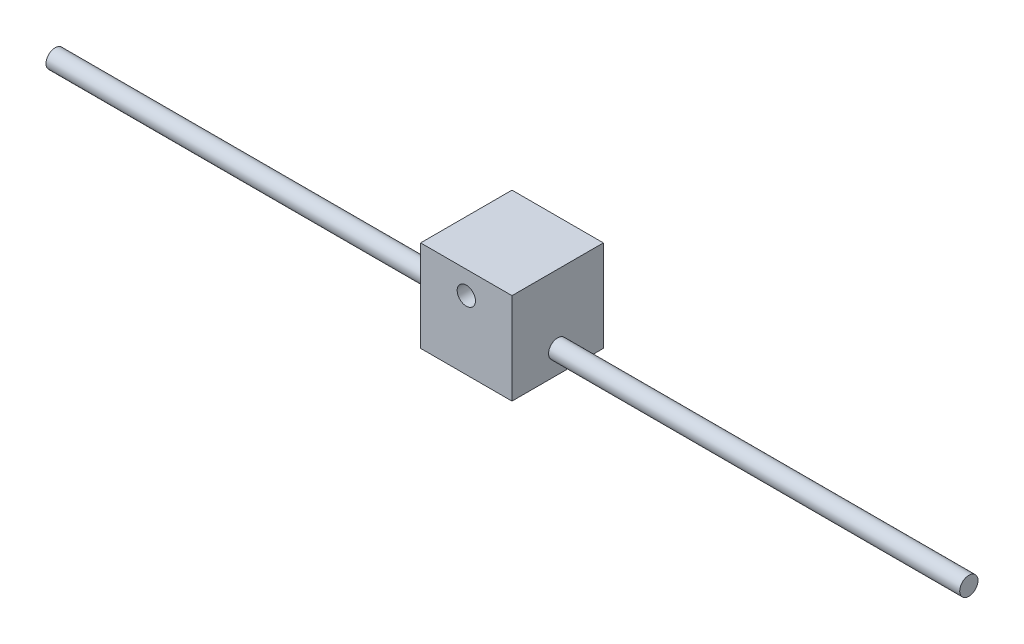
ISO-10303-21;
HEADER;
FILE_DESCRIPTION(('STEP AP214'),'2;1');
FILE_NAME('part.step','',(''),(''),'','','');
FILE_SCHEMA(('AUTOMOTIVE_DESIGN { 1 0 10303 214 1 1 1 1 }'));
ENDSEC;
DATA;
#1=APPLICATION_CONTEXT('core data for automotive mechanical design processes');
#2=APPLICATION_PROTOCOL_DEFINITION('international standard','automotive_design',2000,#1);
#3=PRODUCT_CONTEXT('',#1,'mechanical');
#4=PRODUCT('Part','Part','',(#3));
#5=PRODUCT_RELATED_PRODUCT_CATEGORY('part','',(#4));
#6=PRODUCT_DEFINITION_FORMATION('','',#4);
#7=PRODUCT_DEFINITION_CONTEXT('part definition',#1,'design');
#8=PRODUCT_DEFINITION('design','',#6,#7);
#9=PRODUCT_DEFINITION_SHAPE('','',#8);
#10=(LENGTH_UNIT() NAMED_UNIT(*) SI_UNIT(.MILLI.,.METRE.));
#11=(NAMED_UNIT(*) PLANE_ANGLE_UNIT() SI_UNIT($,.RADIAN.));
#12=(NAMED_UNIT(*) SI_UNIT($,.STERADIAN.) SOLID_ANGLE_UNIT());
#13=UNCERTAINTY_MEASURE_WITH_UNIT(LENGTH_MEASURE(1.E-05),#10,'distance_accuracy_value','');
#14=(GEOMETRIC_REPRESENTATION_CONTEXT(3) GLOBAL_UNCERTAINTY_ASSIGNED_CONTEXT((#13)) GLOBAL_UNIT_ASSIGNED_CONTEXT((#10,
#11,#12)) REPRESENTATION_CONTEXT('',''));
#15=CARTESIAN_POINT('',(0.,0.,0.));
#16=DIRECTION('',(0.,0.,1.));
#17=DIRECTION('',(1.,0.,0.));
#18=AXIS2_PLACEMENT_3D('',#15,#16,#17);
#19=CARTESIAN_POINT('',(200.,-10.,0.));
#20=DIRECTION('',(-1.,0.,0.));
#21=DIRECTION('',(0.,0.,1.));
#22=AXIS2_PLACEMENT_3D('',#19,#20,#21);
#23=CYLINDRICAL_SURFACE('',#22,4.);
#24=CARTESIAN_POINT('',(200.,-10.,0.));
#25=DIRECTION('',(1.,0.,0.));
#26=DIRECTION('',(0.,0.,-1.));
#27=AXIS2_PLACEMENT_3D('',#24,#25,#26);
#28=CIRCLE('',#27,4.);
#29=CARTESIAN_POINT('',(200.,-10.,-4.));
#30=VERTEX_POINT('',#29);
#31=EDGE_CURVE('E11',#30,#30,#28,.T.);
#32=ORIENTED_EDGE('',*,*,#31,.F.);
#33=EDGE_LOOP('',(#32));
#34=FACE_BOUND('',#33,.T.);
#35=CARTESIAN_POINT('',(-200.,-10.,0.));
#36=DIRECTION('',(1.,0.,0.));
#37=DIRECTION('',(0.,0.,-1.));
#38=AXIS2_PLACEMENT_3D('',#35,#36,#37);
#39=CIRCLE('',#38,4.);
#40=CARTESIAN_POINT('',(-200.,-10.,-4.));
#41=VERTEX_POINT('',#40);
#42=EDGE_CURVE('E43',#41,#41,#39,.T.);
#43=ORIENTED_EDGE('',*,*,#42,.T.);
#44=EDGE_LOOP('',(#43));
#45=FACE_BOUND('',#44,.T.);
#46=ADVANCED_FACE('F40',(#34,#45),#23,.T.);
#47=CARTESIAN_POINT('',(200.,-10.,0.));
#48=DIRECTION('',(1.,0.,0.));
#49=DIRECTION('',(0.,0.,-1.));
#50=AXIS2_PLACEMENT_3D('',#47,#48,#49);
#51=PLANE('',#50);
#52=ORIENTED_EDGE('',*,*,#31,.T.);
#53=EDGE_LOOP('',(#52));
#54=FACE_BOUND('',#53,.T.);
#55=ADVANCED_FACE('F55',(#54),#51,.T.);
#56=CARTESIAN_POINT('',(-200.,-10.,0.));
#57=DIRECTION('',(1.,0.,0.));
#58=DIRECTION('',(0.,0.,-1.));
#59=AXIS2_PLACEMENT_3D('',#56,#57,#58);
#60=PLANE('',#59);
#61=ORIENTED_EDGE('',*,*,#42,.F.);
#62=EDGE_LOOP('',(#61));
#63=FACE_BOUND('',#62,.T.);
#64=ADVANCED_FACE('F53',(#63),#60,.F.);
#65=CLOSED_SHELL('',(#46,#55,#64));
#66=MANIFOLD_SOLID_BREP('B2',#65);
#67=CARTESIAN_POINT('',(0.,0.,20.));
#68=DIRECTION('',(0.,0.,1.));
#69=DIRECTION('',(1.,0.,0.));
#70=AXIS2_PLACEMENT_3D('',#67,#68,#69);
#71=PLANE('',#70);
#72=DIRECTION('',(0.,-1.,0.));
#73=VECTOR('',#72,1.);
#74=CARTESIAN_POINT('',(-20.,20.,20.));
#75=LINE('',#74,#73);
#76=CARTESIAN_POINT('',(-20.,20.,20.));
#77=VERTEX_POINT('',#76);
#78=CARTESIAN_POINT('',(-20.,-20.,20.));
#79=VERTEX_POINT('',#78);
#80=EDGE_CURVE('E132',#77,#79,#75,.T.);
#81=ORIENTED_EDGE('',*,*,#80,.T.);
#82=DIRECTION('',(1.,0.,0.));
#83=VECTOR('',#82,1.);
#84=CARTESIAN_POINT('',(-20.,-20.,20.));
#85=LINE('',#84,#83);
#86=CARTESIAN_POINT('',(20.,-20.,20.));
#87=VERTEX_POINT('',#86);
#88=EDGE_CURVE('E127',#79,#87,#85,.T.);
#89=ORIENTED_EDGE('',*,*,#88,.T.);
#90=DIRECTION('',(0.,1.,0.));
#91=VECTOR('',#90,1.);
#92=CARTESIAN_POINT('',(20.,20.,20.));
#93=LINE('',#92,#91);
#94=CARTESIAN_POINT('',(20.,20.,20.));
#95=VERTEX_POINT('',#94);
#96=EDGE_CURVE('E130',#87,#95,#93,.T.);
#97=ORIENTED_EDGE('',*,*,#96,.T.);
#98=DIRECTION('',(-1.,0.,0.));
#99=VECTOR('',#98,1.);
#100=CARTESIAN_POINT('',(-20.,20.,20.));
#101=LINE('',#100,#99);
#102=EDGE_CURVE('E97',#95,#77,#101,.T.);
#103=ORIENTED_EDGE('',*,*,#102,.T.);
#104=EDGE_LOOP('',(#81,#89,#97,#103));
#105=FACE_BOUND('',#104,.T.);
#106=CARTESIAN_POINT('',(0.,10.,20.));
#107=DIRECTION('',(0.,0.,1.));
#108=DIRECTION('',(1.,0.,0.));
#109=AXIS2_PLACEMENT_3D('',#106,#107,#108);
#110=CIRCLE('',#109,4.);
#111=CARTESIAN_POINT('',(4.,10.,20.));
#112=VERTEX_POINT('',#111);
#113=EDGE_CURVE('E147',#112,#112,#110,.T.);
#114=ORIENTED_EDGE('',*,*,#113,.F.);
#115=EDGE_LOOP('',(#114));
#116=FACE_BOUND('',#115,.T.);
#117=ADVANCED_FACE('F80',(#105,#116),#71,.T.);
#118=CARTESIAN_POINT('',(0.,0.,-20.));
#119=DIRECTION('',(0.,0.,1.));
#120=DIRECTION('',(1.,0.,0.));
#121=AXIS2_PLACEMENT_3D('',#118,#119,#120);
#122=PLANE('',#121);
#123=DIRECTION('',(0.,-1.,0.));
#124=VECTOR('',#123,1.);
#125=CARTESIAN_POINT('',(-20.,20.,-20.));
#126=LINE('',#125,#124);
#127=CARTESIAN_POINT('',(-20.,20.,-20.));
#128=VERTEX_POINT('',#127);
#129=CARTESIAN_POINT('',(-20.,-20.,-20.));
#130=VERTEX_POINT('',#129);
#131=EDGE_CURVE('E144',#128,#130,#126,.T.);
#132=ORIENTED_EDGE('',*,*,#131,.F.);
#133=DIRECTION('',(-1.,0.,0.));
#134=VECTOR('',#133,1.);
#135=CARTESIAN_POINT('',(-20.,20.,-20.));
#136=LINE('',#135,#134);
#137=CARTESIAN_POINT('',(20.,20.,-20.));
#138=VERTEX_POINT('',#137);
#139=EDGE_CURVE('E120',#138,#128,#136,.T.);
#140=ORIENTED_EDGE('',*,*,#139,.F.);
#141=DIRECTION('',(0.,1.,0.));
#142=VECTOR('',#141,1.);
#143=CARTESIAN_POINT('',(20.,20.,-20.));
#144=LINE('',#143,#142);
#145=CARTESIAN_POINT('',(20.,-20.,-20.));
#146=VERTEX_POINT('',#145);
#147=EDGE_CURVE('E114',#146,#138,#144,.T.);
#148=ORIENTED_EDGE('',*,*,#147,.F.);
#149=DIRECTION('',(1.,0.,0.));
#150=VECTOR('',#149,1.);
#151=CARTESIAN_POINT('',(-20.,-20.,-20.));
#152=LINE('',#151,#150);
#153=EDGE_CURVE('E136',#130,#146,#152,.T.);
#154=ORIENTED_EDGE('',*,*,#153,.F.);
#155=EDGE_LOOP('',(#132,#140,#148,#154));
#156=FACE_BOUND('',#155,.T.);
#157=CARTESIAN_POINT('',(0.,10.,-20.));
#158=DIRECTION('',(0.,0.,1.));
#159=DIRECTION('',(1.,0.,0.));
#160=AXIS2_PLACEMENT_3D('',#157,#158,#159);
#161=CIRCLE('',#160,4.);
#162=CARTESIAN_POINT('',(4.,10.,-20.));
#163=VERTEX_POINT('',#162);
#164=EDGE_CURVE('E159',#163,#163,#161,.T.);
#165=ORIENTED_EDGE('',*,*,#164,.T.);
#166=EDGE_LOOP('',(#165));
#167=FACE_BOUND('',#166,.T.);
#168=ADVANCED_FACE('F155',(#156,#167),#122,.F.);
#169=CARTESIAN_POINT('',(-20.,20.,20.));
#170=DIRECTION('',(1.,0.,0.));
#171=DIRECTION('',(0.,1.,0.));
#172=AXIS2_PLACEMENT_3D('',#169,#170,#171);
#173=PLANE('',#172);
#174=CARTESIAN_POINT('',(-20.,-10.,0.));
#175=DIRECTION('',(1.,0.,0.));
#176=DIRECTION('',(0.,0.,-1.));
#177=AXIS2_PLACEMENT_3D('',#174,#175,#176);
#178=CIRCLE('',#177,4.);
#179=CARTESIAN_POINT('',(-20.,-10.,-4.));
#180=VERTEX_POINT('',#179);
#181=EDGE_CURVE('E162',#180,#180,#178,.T.);
#182=ORIENTED_EDGE('',*,*,#181,.T.);
#183=EDGE_LOOP('',(#182));
#184=FACE_BOUND('',#183,.T.);
#185=ORIENTED_EDGE('',*,*,#131,.T.);
#186=DIRECTION('',(0.,0.,-1.));
#187=VECTOR('',#186,1.);
#188=CARTESIAN_POINT('',(-20.,-20.,20.));
#189=LINE('',#188,#187);
#190=EDGE_CURVE('E38',#79,#130,#189,.T.);
#191=ORIENTED_EDGE('',*,*,#190,.F.);
#192=ORIENTED_EDGE('',*,*,#80,.F.);
#193=DIRECTION('',(0.,0.,-1.));
#194=VECTOR('',#193,1.);
#195=CARTESIAN_POINT('',(-20.,20.,20.));
#196=LINE('',#195,#194);
#197=EDGE_CURVE('E140',#77,#128,#196,.T.);
#198=ORIENTED_EDGE('',*,*,#197,.T.);
#199=EDGE_LOOP('',(#185,#191,#192,#198));
#200=FACE_BOUND('',#199,.T.);
#201=ADVANCED_FACE('F82',(#184,#200),#173,.F.);
#202=CARTESIAN_POINT('',(-20.,-20.,20.));
#203=DIRECTION('',(0.,1.,0.));
#204=DIRECTION('',(-1.,0.,0.));
#205=AXIS2_PLACEMENT_3D('',#202,#203,#204);
#206=PLANE('',#205);
#207=ORIENTED_EDGE('',*,*,#153,.T.);
#208=DIRECTION('',(0.,0.,-1.));
#209=VECTOR('',#208,1.);
#210=CARTESIAN_POINT('',(20.,-20.,20.));
#211=LINE('',#210,#209);
#212=EDGE_CURVE('E89',#87,#146,#211,.T.);
#213=ORIENTED_EDGE('',*,*,#212,.F.);
#214=ORIENTED_EDGE('',*,*,#88,.F.);
#215=ORIENTED_EDGE('',*,*,#190,.T.);
#216=EDGE_LOOP('',(#207,#213,#214,#215));
#217=FACE_BOUND('',#216,.T.);
#218=ADVANCED_FACE('F135',(#217),#206,.F.);
#219=CARTESIAN_POINT('',(20.,20.,20.));
#220=DIRECTION('',(-1.,0.,0.));
#221=DIRECTION('',(0.,0.,1.));
#222=AXIS2_PLACEMENT_3D('',#219,#220,#221);
#223=PLANE('',#222);
#224=CARTESIAN_POINT('',(20.,-10.,0.));
#225=DIRECTION('',(1.,0.,0.));
#226=DIRECTION('',(0.,0.,-1.));
#227=AXIS2_PLACEMENT_3D('',#224,#225,#226);
#228=CIRCLE('',#227,4.);
#229=CARTESIAN_POINT('',(20.,-10.,-4.));
#230=VERTEX_POINT('',#229);
#231=EDGE_CURVE('E165',#230,#230,#228,.T.);
#232=ORIENTED_EDGE('',*,*,#231,.F.);
#233=EDGE_LOOP('',(#232));
#234=FACE_BOUND('',#233,.T.);
#235=ORIENTED_EDGE('',*,*,#147,.T.);
#236=DIRECTION('',(0.,0.,-1.));
#237=VECTOR('',#236,1.);
#238=CARTESIAN_POINT('',(20.,20.,20.));
#239=LINE('',#238,#237);
#240=EDGE_CURVE('E137',#95,#138,#239,.T.);
#241=ORIENTED_EDGE('',*,*,#240,.F.);
#242=ORIENTED_EDGE('',*,*,#96,.F.);
#243=ORIENTED_EDGE('',*,*,#212,.T.);
#244=EDGE_LOOP('',(#235,#241,#242,#243));
#245=FACE_BOUND('',#244,.T.);
#246=ADVANCED_FACE('F138',(#234,#245),#223,.F.);
#247=CARTESIAN_POINT('',(-20.,20.,20.));
#248=DIRECTION('',(0.,-1.,0.));
#249=DIRECTION('',(1.,0.,0.));
#250=AXIS2_PLACEMENT_3D('',#247,#248,#249);
#251=PLANE('',#250);
#252=ORIENTED_EDGE('',*,*,#139,.T.);
#253=ORIENTED_EDGE('',*,*,#197,.F.);
#254=ORIENTED_EDGE('',*,*,#102,.F.);
#255=ORIENTED_EDGE('',*,*,#240,.T.);
#256=EDGE_LOOP('',(#252,#253,#254,#255));
#257=FACE_BOUND('',#256,.T.);
#258=ADVANCED_FACE('F152',(#257),#251,.F.);
#259=CARTESIAN_POINT('',(0.,10.,20.));
#260=DIRECTION('',(0.,0.,-1.));
#261=DIRECTION('',(-1.,0.,0.));
#262=AXIS2_PLACEMENT_3D('',#259,#260,#261);
#263=CYLINDRICAL_SURFACE('',#262,4.);
#264=ORIENTED_EDGE('',*,*,#113,.T.);
#265=EDGE_LOOP('',(#264));
#266=FACE_BOUND('',#265,.T.);
#267=ORIENTED_EDGE('',*,*,#164,.F.);
#268=EDGE_LOOP('',(#267));
#269=FACE_BOUND('',#268,.T.);
#270=ADVANCED_FACE('F175',(#266,#269),#263,.F.);
#271=CARTESIAN_POINT('',(-20.,-10.,0.));
#272=DIRECTION('',(1.,0.,0.));
#273=DIRECTION('',(0.,0.,-1.));
#274=AXIS2_PLACEMENT_3D('',#271,#272,#273);
#275=CYLINDRICAL_SURFACE('',#274,4.);
#276=ORIENTED_EDGE('',*,*,#181,.F.);
#277=EDGE_LOOP('',(#276));
#278=FACE_BOUND('',#277,.T.);
#279=ORIENTED_EDGE('',*,*,#231,.T.);
#280=EDGE_LOOP('',(#279));
#281=FACE_BOUND('',#280,.T.);
#282=ADVANCED_FACE('F172',(#278,#281),#275,.F.);
#283=CLOSED_SHELL('',(#117,#168,#201,#218,#246,#258,#270,#282));
#284=MANIFOLD_SOLID_BREP('B6',#283);
#285=ADVANCED_BREP_SHAPE_REPRESENTATION('',(#18,#66,#284),#14);
#286=SHAPE_DEFINITION_REPRESENTATION(#9,#285);
ENDSEC;
END-ISO-10303-21;
